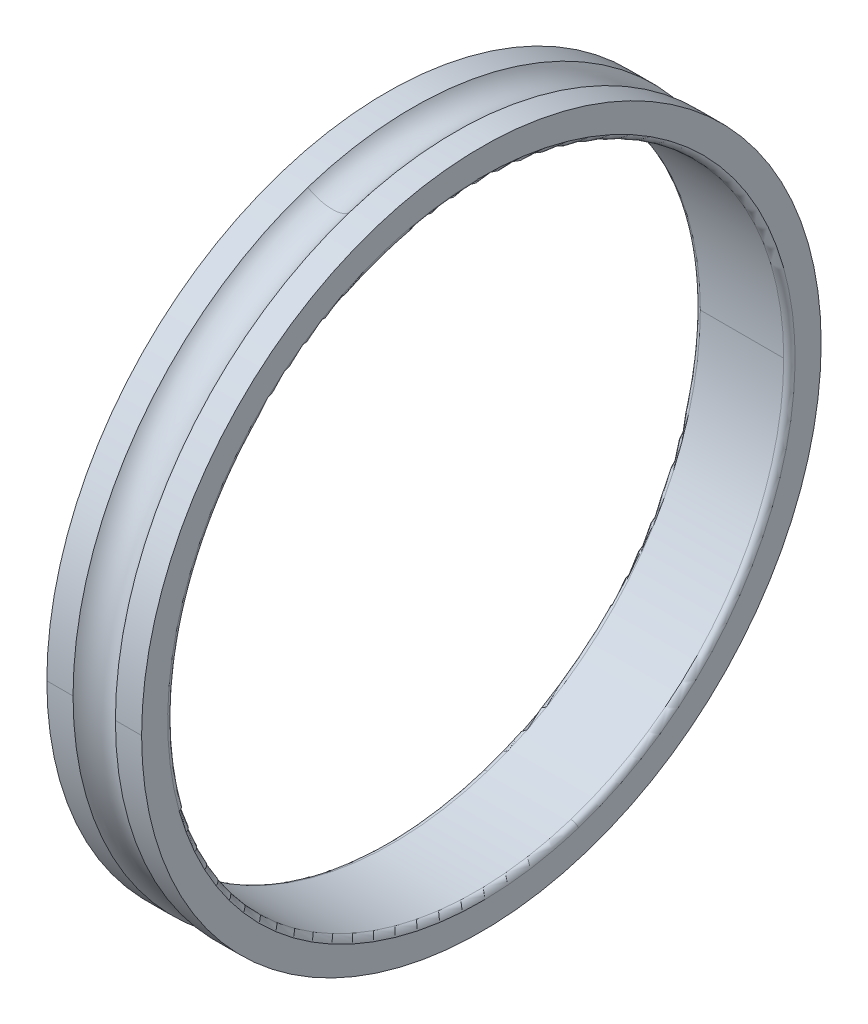
ISO-10303-21;
HEADER;
FILE_DESCRIPTION(('STEP AP214'),'2;1');
FILE_NAME('part.step','',(''),(''),'','','');
FILE_SCHEMA(('AUTOMOTIVE_DESIGN { 1 0 10303 214 1 1 1 1 }'));
ENDSEC;
DATA;
#1=APPLICATION_CONTEXT('core data for automotive mechanical design processes');
#2=APPLICATION_PROTOCOL_DEFINITION('international standard','automotive_design',2000,#1);
#3=PRODUCT_CONTEXT('',#1,'mechanical');
#4=PRODUCT('Part','Part','',(#3));
#5=PRODUCT_RELATED_PRODUCT_CATEGORY('part','',(#4));
#6=PRODUCT_DEFINITION_FORMATION('','',#4);
#7=PRODUCT_DEFINITION_CONTEXT('part definition',#1,'design');
#8=PRODUCT_DEFINITION('design','',#6,#7);
#9=PRODUCT_DEFINITION_SHAPE('','',#8);
#10=(LENGTH_UNIT() NAMED_UNIT(*) SI_UNIT(.MILLI.,.METRE.));
#11=(NAMED_UNIT(*) PLANE_ANGLE_UNIT() SI_UNIT($,.RADIAN.));
#12=(NAMED_UNIT(*) SI_UNIT($,.STERADIAN.) SOLID_ANGLE_UNIT());
#13=UNCERTAINTY_MEASURE_WITH_UNIT(LENGTH_MEASURE(1.E-05),#10,'distance_accuracy_value','');
#14=(GEOMETRIC_REPRESENTATION_CONTEXT(3) GLOBAL_UNCERTAINTY_ASSIGNED_CONTEXT((#13)) GLOBAL_UNIT_ASSIGNED_CONTEXT((#10,
#11,#12)) REPRESENTATION_CONTEXT('',''));
#15=CARTESIAN_POINT('',(0.,0.,0.));
#16=DIRECTION('',(0.,0.,1.));
#17=DIRECTION('',(1.,0.,0.));
#18=AXIS2_PLACEMENT_3D('',#15,#16,#17);
#19=CARTESIAN_POINT('',(10.,0.,0.));
#20=DIRECTION('',(1.,0.,0.));
#21=DIRECTION('',(0.,1.,0.));
#22=AXIS2_PLACEMENT_3D('',#19,#20,#21);
#23=CYLINDRICAL_SURFACE('',#22,35.85);
#24=DIRECTION('',(1.,0.,0.));
#25=VECTOR('',#24,1.);
#26=CARTESIAN_POINT('',(0.,0.,35.85));
#27=LINE('',#26,#25);
#28=CARTESIAN_POINT('',(0.,0.,35.85));
#29=VERTEX_POINT('',#28);
#30=CARTESIAN_POINT('',(2.7650986598957,0.,35.85));
#31=VERTEX_POINT('',#30);
#32=EDGE_CURVE('E11',#29,#31,#27,.T.);
#33=ORIENTED_EDGE('',*,*,#32,.F.);
#34=CARTESIAN_POINT('',(0.,0.,0.));
#35=DIRECTION('',(1.,0.,0.));
#36=DIRECTION('',(0.,0.,-1.));
#37=AXIS2_PLACEMENT_3D('',#34,#35,#36);
#38=CIRCLE('',#37,35.85);
#39=CARTESIAN_POINT('',(0.,0.,-35.85));
#40=VERTEX_POINT('',#39);
#41=EDGE_CURVE('E25',#29,#40,#38,.T.);
#42=ORIENTED_EDGE('',*,*,#41,.T.);
#43=DIRECTION('',(1.,0.,0.));
#44=VECTOR('',#43,1.);
#45=CARTESIAN_POINT('',(0.,0.,-35.85));
#46=LINE('',#45,#44);
#47=CARTESIAN_POINT('',(2.7650986598957,0.,-35.85));
#48=VERTEX_POINT('',#47);
#49=EDGE_CURVE('E326',#40,#48,#46,.T.);
#50=ORIENTED_EDGE('',*,*,#49,.T.);
#51=CARTESIAN_POINT('',(2.7650986598957,0.,0.));
#52=DIRECTION('',(1.,0.,0.));
#53=DIRECTION('',(0.,0.,-1.));
#54=AXIS2_PLACEMENT_3D('',#51,#52,#53);
#55=CIRCLE('',#54,35.85);
#56=CARTESIAN_POINT('',(2.7650986598957,-34.0953761091813,-11.0782592483419));
#57=VERTEX_POINT('',#56);
#58=EDGE_CURVE('E321',#57,#48,#55,.T.);
#59=ORIENTED_EDGE('',*,*,#58,.F.);
#60=CARTESIAN_POINT('',(2.7650986598957,0.,0.));
#61=DIRECTION('',(1.,0.,0.));
#62=DIRECTION('',(0.,0.,-1.));
#63=AXIS2_PLACEMENT_3D('',#60,#61,#62);
#64=CIRCLE('',#63,35.85);
#65=EDGE_CURVE('E316',#31,#57,#64,.T.);
#66=ORIENTED_EDGE('',*,*,#65,.F.);
#67=EDGE_LOOP('',(#33,#42,#50,#59,#66));
#68=FACE_BOUND('',#67,.T.);
#69=ADVANCED_FACE('F17',(#68),#23,.T.);
#70=CARTESIAN_POINT('',(5.,0.,0.));
#71=DIRECTION('',(1.,0.,0.));
#72=DIRECTION('',(0.,0.309016994374947,-0.951056516295154));
#73=AXIS2_PLACEMENT_3D('',#70,#71,#72);
#74=TOROIDAL_SURFACE('',#73,37.5,2.778);
#75=CARTESIAN_POINT('',(5.,-35.6646193610683,-11.5881372890605));
#76=DIRECTION('',(0.,0.309016994374947,-0.951056516295154));
#77=DIRECTION('',(-0.804500122427753,0.564882380088916,0.183541411345811));
#78=AXIS2_PLACEMENT_3D('',#75,#76,#77);
#79=CIRCLE('',#78,2.778);
#80=CARTESIAN_POINT('',(7.2349013401043,-34.0953761091813,-11.0782592483419));
#81=VERTEX_POINT('',#80);
#82=EDGE_CURVE('E312',#57,#81,#79,.T.);
#83=ORIENTED_EDGE('',*,*,#82,.T.);
#84=CARTESIAN_POINT('',(7.2349013401043,0.,0.));
#85=DIRECTION('',(1.,0.,0.));
#86=DIRECTION('',(0.,0.,-1.));
#87=AXIS2_PLACEMENT_3D('',#84,#85,#86);
#88=CIRCLE('',#87,35.85);
#89=CARTESIAN_POINT('',(7.2349013401043,0.,35.85));
#90=VERTEX_POINT('',#89);
#91=EDGE_CURVE('E110',#90,#81,#88,.T.);
#92=ORIENTED_EDGE('',*,*,#91,.F.);
#93=CARTESIAN_POINT('',(7.2349013401043,0.,0.));
#94=DIRECTION('',(1.,0.,0.));
#95=DIRECTION('',(0.,0.,-1.));
#96=AXIS2_PLACEMENT_3D('',#93,#94,#95);
#97=CIRCLE('',#96,35.85);
#98=CARTESIAN_POINT('',(7.2349013401043,34.0953761091813,11.0782592483419));
#99=VERTEX_POINT('',#98);
#100=EDGE_CURVE('E305',#99,#90,#97,.T.);
#101=ORIENTED_EDGE('',*,*,#100,.F.);
#102=CARTESIAN_POINT('',(5.,35.6646193610683,11.5881372890605));
#103=DIRECTION('',(0.,-0.309016994374947,0.951056516295154));
#104=DIRECTION('',(-0.804500122427754,-0.564882380088914,-0.183541411345811));
#105=AXIS2_PLACEMENT_3D('',#102,#103,#104);
#106=CIRCLE('',#105,2.778);
#107=CARTESIAN_POINT('',(2.7650986598957,34.0953761091813,11.0782592483419));
#108=VERTEX_POINT('',#107);
#109=EDGE_CURVE('E120',#108,#99,#106,.T.);
#110=ORIENTED_EDGE('',*,*,#109,.F.);
#111=CARTESIAN_POINT('',(2.7650986598957,0.,0.));
#112=DIRECTION('',(1.,0.,0.));
#113=DIRECTION('',(0.,0.,-1.));
#114=AXIS2_PLACEMENT_3D('',#111,#112,#113);
#115=CIRCLE('',#114,35.85);
#116=EDGE_CURVE('E297',#108,#31,#115,.T.);
#117=ORIENTED_EDGE('',*,*,#116,.T.);
#118=ORIENTED_EDGE('',*,*,#65,.T.);
#119=EDGE_LOOP('',(#83,#92,#101,#110,#117,#118));
#120=FACE_BOUND('',#119,.T.);
#121=ADVANCED_FACE('F339',(#120),#74,.F.);
#122=CARTESIAN_POINT('',(10.,0.,0.));
#123=DIRECTION('',(1.,0.,0.));
#124=DIRECTION('',(0.,-1.,0.));
#125=AXIS2_PLACEMENT_3D('',#122,#123,#124);
#126=CYLINDRICAL_SURFACE('',#125,35.85);
#127=ORIENTED_EDGE('',*,*,#32,.T.);
#128=ORIENTED_EDGE('',*,*,#116,.F.);
#129=CARTESIAN_POINT('',(2.7650986598957,0.,0.));
#130=DIRECTION('',(1.,0.,0.));
#131=DIRECTION('',(0.,0.,-1.));
#132=AXIS2_PLACEMENT_3D('',#129,#130,#131);
#133=CIRCLE('',#132,35.85);
#134=EDGE_CURVE('E293',#48,#108,#133,.T.);
#135=ORIENTED_EDGE('',*,*,#134,.F.);
#136=ORIENTED_EDGE('',*,*,#49,.F.);
#137=CARTESIAN_POINT('',(0.,0.,0.));
#138=DIRECTION('',(1.,0.,0.));
#139=DIRECTION('',(0.,0.,-1.));
#140=AXIS2_PLACEMENT_3D('',#137,#138,#139);
#141=CIRCLE('',#140,35.85);
#142=EDGE_CURVE('E289',#40,#29,#141,.T.);
#143=ORIENTED_EDGE('',*,*,#142,.T.);
#144=EDGE_LOOP('',(#127,#128,#135,#136,#143));
#145=FACE_BOUND('',#144,.T.);
#146=ADVANCED_FACE('F270',(#145),#126,.T.);
#147=CARTESIAN_POINT('',(0.,35.85,0.));
#148=DIRECTION('',(-1.,0.,0.));
#149=DIRECTION('',(0.,0.,1.));
#150=AXIS2_PLACEMENT_3D('',#147,#148,#149);
#151=PLANE('',#150);
#152=CARTESIAN_POINT('',(0.,0.,0.));
#153=DIRECTION('',(1.,0.,0.));
#154=DIRECTION('',(0.,0.,-1.));
#155=AXIS2_PLACEMENT_3D('',#152,#153,#154);
#156=CIRCLE('',#155,33.1);
#157=CARTESIAN_POINT('',(0.,31.4799706893696,10.2284625138108));
#158=VERTEX_POINT('',#157);
#159=CARTESIAN_POINT('',(0.,-31.4799706893696,-10.2284625138108));
#160=VERTEX_POINT('',#159);
#161=EDGE_CURVE('E287',#158,#160,#156,.T.);
#162=ORIENTED_EDGE('',*,*,#161,.T.);
#163=CARTESIAN_POINT('',(0.,-31.4799706893696,-10.2284625138108));
#164=CARTESIAN_POINT('',(0.,-29.8732222975507,-15.1732784787861));
#165=CARTESIAN_POINT('',(0.,-27.2959614558918,-19.8029100136131));
#166=CARTESIAN_POINT('',(0.,-23.8290176388715,-23.8619609163292));
#167=CARTESIAN_POINT('',(0.,-15.4904675059238,-30.4017426634076));
#168=CARTESIAN_POINT('',(0.,-5.29838951479689,-33.3038175593955));
#169=CARTESIAN_POINT('',(0.,0.0232956870978851,-33.722652342829));
#170=CARTESIAN_POINT('',(0.,10.5438616298009,-32.4506693562922));
#171=CARTESIAN_POINT('',(0.,19.8028311085433,-27.2958917020649));
#172=CARTESIAN_POINT('',(0.,23.8619799667405,-23.8290391654151));
#173=CARTESIAN_POINT('',(0.,30.4017474446471,-15.4904581222128));
#174=CARTESIAN_POINT('',(0.,33.3037889465051,-5.29838675567528));
#175=CARTESIAN_POINT('',(0.,33.7227551540967,0.0232728518260998));
#176=CARTESIAN_POINT('',(0.,33.0865738342163,5.28359935523333));
#177=CARTESIAN_POINT('',(0.,31.4799706893696,10.2284625138107));
#178=B_SPLINE_CURVE_WITH_KNOTS('',5,(#163,#164,#165,#166,#167,#168,#169,#170,#171,#172,#173,
#174,#175,#176,#177),.UNSPECIFIED.,.F.,.F.,(6,3,3,3,6),(0.,0.785398163397448,1.5707963267949,
2.35619449019234,3.14159265358979),.UNSPECIFIED.);
#179=EDGE_CURVE('E285',#160,#158,#178,.T.);
#180=ORIENTED_EDGE('',*,*,#179,.T.);
#181=EDGE_LOOP('',(#162,#180));
#182=FACE_BOUND('',#181,.T.);
#183=ORIENTED_EDGE('',*,*,#41,.F.);
#184=ORIENTED_EDGE('',*,*,#142,.F.);
#185=EDGE_LOOP('',(#183,#184));
#186=FACE_BOUND('',#185,.T.);
#187=ADVANCED_FACE('F264',(#182,#186),#151,.T.);
#188=CARTESIAN_POINT('',(0.599999999999877,0.,0.));
#189=DIRECTION('',(1.,0.,0.));
#190=DIRECTION('',(0.,-0.309016994374947,0.951056516295154));
#191=AXIS2_PLACEMENT_3D('',#188,#189,#190);
#192=TOROIDAL_SURFACE('',#191,33.1,0.599999999999877);
#193=CARTESIAN_POINT('',(0.599999999999877,-31.4799706893696,-10.2284625138108));
#194=DIRECTION('',(0.,0.309016994374947,-0.951056516295154));
#195=DIRECTION('',(-1.,0.,0.));
#196=AXIS2_PLACEMENT_3D('',#193,#194,#195);
#197=CIRCLE('',#196,0.599999999999877);
#198=CARTESIAN_POINT('',(0.600000000000001,-30.9093367795926,-10.0430523171858));
#199=VERTEX_POINT('',#198);
#200=EDGE_CURVE('E494',#160,#199,#197,.T.);
#201=ORIENTED_EDGE('',*,*,#200,.T.);
#202=CARTESIAN_POINT('',(0.6,0.,0.));
#203=DIRECTION('',(1.,0.,0.));
#204=DIRECTION('',(0.,0.,-1.));
#205=AXIS2_PLACEMENT_3D('',#202,#203,#204);
#206=CIRCLE('',#205,32.5);
#207=CARTESIAN_POINT('',(0.6,0.,-32.5));
#208=VERTEX_POINT('',#207);
#209=EDGE_CURVE('E492',#199,#208,#206,.T.);
#210=ORIENTED_EDGE('',*,*,#209,.T.);
#211=CARTESIAN_POINT('',(0.6,0.,0.));
#212=DIRECTION('',(1.,0.,0.));
#213=DIRECTION('',(0.,0.,-1.));
#214=AXIS2_PLACEMENT_3D('',#211,#212,#213);
#215=CIRCLE('',#214,32.5);
#216=CARTESIAN_POINT('',(0.600000000000001,30.9093367795926,10.0430523171858));
#217=VERTEX_POINT('',#216);
#218=EDGE_CURVE('E490',#208,#217,#215,.T.);
#219=ORIENTED_EDGE('',*,*,#218,.T.);
#220=CARTESIAN_POINT('',(0.599999999999877,31.4799706893696,10.2284625138108));
#221=DIRECTION('',(0.,-0.309016994374947,0.951056516295154));
#222=DIRECTION('',(-1.,0.,0.));
#223=AXIS2_PLACEMENT_3D('',#220,#221,#222);
#224=CIRCLE('',#223,0.599999999999877);
#225=EDGE_CURVE('E244',#158,#217,#224,.T.);
#226=ORIENTED_EDGE('',*,*,#225,.F.);
#227=ORIENTED_EDGE('',*,*,#179,.F.);
#228=EDGE_LOOP('',(#201,#210,#219,#226,#227));
#229=FACE_BOUND('',#228,.T.);
#230=ADVANCED_FACE('F253',(#229),#192,.T.);
#231=CARTESIAN_POINT('',(0.599999999999877,0.,0.));
#232=DIRECTION('',(1.,0.,0.));
#233=DIRECTION('',(0.,0.309016994374947,-0.951056516295154));
#234=AXIS2_PLACEMENT_3D('',#231,#232,#233);
#235=TOROIDAL_SURFACE('',#234,33.1,0.599999999999877);
#236=ORIENTED_EDGE('',*,*,#200,.F.);
#237=ORIENTED_EDGE('',*,*,#161,.F.);
#238=ORIENTED_EDGE('',*,*,#225,.T.);
#239=CARTESIAN_POINT('',(0.6,0.,0.));
#240=DIRECTION('',(1.,0.,0.));
#241=DIRECTION('',(0.,0.,-1.));
#242=AXIS2_PLACEMENT_3D('',#239,#240,#241);
#243=CIRCLE('',#242,32.5);
#244=CARTESIAN_POINT('',(0.6,0.,32.5));
#245=VERTEX_POINT('',#244);
#246=EDGE_CURVE('E240',#217,#245,#243,.T.);
#247=ORIENTED_EDGE('',*,*,#246,.T.);
#248=CARTESIAN_POINT('',(0.6,0.,0.));
#249=DIRECTION('',(1.,0.,0.));
#250=DIRECTION('',(0.,0.,-1.));
#251=AXIS2_PLACEMENT_3D('',#248,#249,#250);
#252=CIRCLE('',#251,32.5);
#253=EDGE_CURVE('E235',#245,#199,#252,.T.);
#254=ORIENTED_EDGE('',*,*,#253,.T.);
#255=EDGE_LOOP('',(#236,#237,#238,#247,#254));
#256=FACE_BOUND('',#255,.T.);
#257=ADVANCED_FACE('F263',(#256),#235,.T.);
#258=CARTESIAN_POINT('',(10.,0.,0.));
#259=DIRECTION('',(1.,0.,0.));
#260=DIRECTION('',(0.,1.,0.));
#261=AXIS2_PLACEMENT_3D('',#258,#259,#260);
#262=CYLINDRICAL_SURFACE('',#261,32.5);
#263=DIRECTION('',(1.,0.,0.));
#264=VECTOR('',#263,1.);
#265=CARTESIAN_POINT('',(0.6,0.,32.5));
#266=LINE('',#265,#264);
#267=CARTESIAN_POINT('',(9.4,0.,32.5));
#268=VERTEX_POINT('',#267);
#269=EDGE_CURVE('E231',#245,#268,#266,.T.);
#270=ORIENTED_EDGE('',*,*,#269,.T.);
#271=CARTESIAN_POINT('',(9.4,0.,0.));
#272=DIRECTION('',(1.,0.,0.));
#273=DIRECTION('',(0.,0.,-1.));
#274=AXIS2_PLACEMENT_3D('',#271,#272,#273);
#275=CIRCLE('',#274,32.5);
#276=CARTESIAN_POINT('',(9.4,-30.9093367795926,-10.0430523171858));
#277=VERTEX_POINT('',#276);
#278=EDGE_CURVE('E227',#268,#277,#275,.T.);
#279=ORIENTED_EDGE('',*,*,#278,.T.);
#280=CARTESIAN_POINT('',(9.4,0.,0.));
#281=DIRECTION('',(1.,0.,0.));
#282=DIRECTION('',(0.,0.,-1.));
#283=AXIS2_PLACEMENT_3D('',#280,#281,#282);
#284=CIRCLE('',#283,32.5);
#285=CARTESIAN_POINT('',(9.4,0.,-32.5));
#286=VERTEX_POINT('',#285);
#287=EDGE_CURVE('E223',#277,#286,#284,.T.);
#288=ORIENTED_EDGE('',*,*,#287,.T.);
#289=DIRECTION('',(1.,0.,0.));
#290=VECTOR('',#289,1.);
#291=CARTESIAN_POINT('',(0.6,0.,-32.5));
#292=LINE('',#291,#290);
#293=EDGE_CURVE('E218',#208,#286,#292,.T.);
#294=ORIENTED_EDGE('',*,*,#293,.F.);
#295=ORIENTED_EDGE('',*,*,#209,.F.);
#296=ORIENTED_EDGE('',*,*,#253,.F.);
#297=EDGE_LOOP('',(#270,#279,#288,#294,#295,#296));
#298=FACE_BOUND('',#297,.T.);
#299=ADVANCED_FACE('F390',(#298),#262,.F.);
#300=CARTESIAN_POINT('',(10.,0.,0.));
#301=DIRECTION('',(1.,0.,0.));
#302=DIRECTION('',(0.,-1.,0.));
#303=AXIS2_PLACEMENT_3D('',#300,#301,#302);
#304=CYLINDRICAL_SURFACE('',#303,32.5);
#305=ORIENTED_EDGE('',*,*,#269,.F.);
#306=ORIENTED_EDGE('',*,*,#246,.F.);
#307=ORIENTED_EDGE('',*,*,#218,.F.);
#308=ORIENTED_EDGE('',*,*,#293,.T.);
#309=CARTESIAN_POINT('',(9.4,0.,0.));
#310=DIRECTION('',(1.,0.,0.));
#311=DIRECTION('',(0.,0.,-1.));
#312=AXIS2_PLACEMENT_3D('',#309,#310,#311);
#313=CIRCLE('',#312,32.5);
#314=CARTESIAN_POINT('',(9.4,30.9093367795926,10.0430523171858));
#315=VERTEX_POINT('',#314);
#316=EDGE_CURVE('E214',#286,#315,#313,.T.);
#317=ORIENTED_EDGE('',*,*,#316,.T.);
#318=CARTESIAN_POINT('',(9.4,0.,0.));
#319=DIRECTION('',(1.,0.,0.));
#320=DIRECTION('',(0.,0.,-1.));
#321=AXIS2_PLACEMENT_3D('',#318,#319,#320);
#322=CIRCLE('',#321,32.5);
#323=EDGE_CURVE('E209',#315,#268,#322,.T.);
#324=ORIENTED_EDGE('',*,*,#323,.T.);
#325=EDGE_LOOP('',(#305,#306,#307,#308,#317,#324));
#326=FACE_BOUND('',#325,.T.);
#327=ADVANCED_FACE('F400',(#326),#304,.F.);
#328=CARTESIAN_POINT('',(9.4,0.,0.));
#329=DIRECTION('',(1.,0.,0.));
#330=DIRECTION('',(0.,0.309016994374947,-0.951056516295154));
#331=AXIS2_PLACEMENT_3D('',#328,#329,#330);
#332=TOROIDAL_SURFACE('',#331,33.1,0.599999999999927);
#333=CARTESIAN_POINT('',(9.4,-31.4799706893696,-10.2284625138108));
#334=DIRECTION('',(0.,0.309016994374947,-0.951056516295154));
#335=DIRECTION('',(0.,0.951056516295154,0.309016994374947));
#336=AXIS2_PLACEMENT_3D('',#333,#334,#335);
#337=CIRCLE('',#336,0.59999999999993);
#338=CARTESIAN_POINT('',(9.99999999999993,-31.4799706893696,-10.2284625138108));
#339=VERTEX_POINT('',#338);
#340=EDGE_CURVE('E188',#277,#339,#337,.T.);
#341=ORIENTED_EDGE('',*,*,#340,.F.);
#342=ORIENTED_EDGE('',*,*,#278,.F.);
#343=ORIENTED_EDGE('',*,*,#323,.F.);
#344=CARTESIAN_POINT('',(9.4,31.4799706893696,10.2284625138108));
#345=DIRECTION('',(0.,-0.309016994374947,0.951056516295154));
#346=DIRECTION('',(0.,-0.951056516295154,-0.309016994374947));
#347=AXIS2_PLACEMENT_3D('',#344,#345,#346);
#348=CIRCLE('',#347,0.59999999999993);
#349=CARTESIAN_POINT('',(9.99999999999993,31.4799706893696,10.2284625138108));
#350=VERTEX_POINT('',#349);
#351=EDGE_CURVE('E187',#315,#350,#348,.T.);
#352=ORIENTED_EDGE('',*,*,#351,.T.);
#353=CARTESIAN_POINT('',(9.99999999999993,31.4799706893696,10.2284625138108));
#354=CARTESIAN_POINT('',(9.99999999999993,31.3126186201895,10.7435564000536));
#355=CARTESIAN_POINT('',(9.99999999999993,31.1326031832768,11.254534680821));
#356=CARTESIAN_POINT('',(9.99999999999993,30.7477264537561,12.2670469839427));
#357=CARTESIAN_POINT('',(9.99999999999993,30.5428651611481,12.7685810062971));
#358=CARTESIAN_POINT('',(9.99999999999993,30.1087776000063,13.7609917451309));
#359=CARTESIAN_POINT('',(9.99999999999993,29.8795513314726,14.2518684616103));
#360=CARTESIAN_POINT('',(9.99999999999993,29.3972894339351,15.2217833120077));
#361=CARTESIAN_POINT('',(9.99999999999993,29.1442538049313,15.7008214459257));
#362=CARTESIAN_POINT('',(9.99999999999993,28.6149818632878,16.6459047411728));
#363=CARTESIAN_POINT('',(9.99999999999993,28.3387455506482,17.1119499025018));
#364=CARTESIAN_POINT('',(9.99999999999993,27.7637379625461,18.0299246014538));
#365=CARTESIAN_POINT('',(9.99999999999993,27.4649666870837,18.4818541390767));
#366=CARTESIAN_POINT('',(9.99999999999993,26.8456088743052,19.3705088279913));
#367=CARTESIAN_POINT('',(9.99999999999993,26.5250223369891,19.8072339792831));
#368=CARTESIAN_POINT('',(9.99999999999993,25.8628063390226,20.6644277930343));
#369=CARTESIAN_POINT('',(9.99999999999993,25.5211768783722,21.0848964554938));
#370=CARTESIAN_POINT('',(9.99999999999993,24.8176980443498,21.9085643439645));
#371=CARTESIAN_POINT('',(9.99999999999993,24.4558486709777,22.3117635699757));
#372=CARTESIAN_POINT('',(9.99999999999993,23.712801739601,23.0999212437751));
#373=CARTESIAN_POINT('',(9.99999999999993,23.3316041815964,23.4848796915634));
#374=CARTESIAN_POINT('',(9.99999999999993,22.5507792189246,24.2356284101699));
#375=CARTESIAN_POINT('',(9.99999999999993,22.1511518142575,24.6014186809883));
#376=CARTESIAN_POINT('',(9.99999999999993,21.3344298957718,25.3129498248875));
#377=CARTESIAN_POINT('',(9.99999999999993,20.9173353819533,25.6586906979684));
#378=CARTESIAN_POINT('',(9.99999999999993,20.0666840623577,26.329290126337));
#379=CARTESIAN_POINT('',(9.99999999999993,19.6331272565806,26.6541486816246));
#380=CARTESIAN_POINT('',(9.99999999999993,18.7505958293945,27.2822008616952));
#381=CARTESIAN_POINT('',(9.99999999999993,18.3016212079856,27.5853944864782));
#382=CARTESIAN_POINT('',(9.99999999999993,17.3893357687226,28.16938638554));
#383=CARTESIAN_POINT('',(9.99999999999993,16.9260249508685,28.4501846598189));
#384=CARTESIAN_POINT('',(9.99999999999993,15.9861832750572,28.988709390235));
#385=CARTESIAN_POINT('',(9.99999999999993,15.5096524170999,29.2464358463722));
#386=CARTESIAN_POINT('',(9.99999999999993,14.544518665658,29.7381960548978));
#387=CARTESIAN_POINT('',(9.99999999999993,14.0559157721734,29.9722298072863));
#388=CARTESIAN_POINT('',(9.99999999999993,13.0678150368439,30.4160408005061));
#389=CARTESIAN_POINT('',(9.99999999999993,12.568317194999,30.6258180413374));
#390=CARTESIAN_POINT('',(9.99999999999993,11.5596298970006,31.0206106396954));
#391=CARTESIAN_POINT('',(9.99999999999993,11.0504404408472,31.2056259972221));
#392=CARTESIAN_POINT('',(9.99999999999993,10.0235965962315,31.5504491107691));
#393=CARTESIAN_POINT('',(9.99999999999993,9.50594220776919,31.7102568667895));
#394=CARTESIAN_POINT('',(9.99999999999993,8.46341557329866,32.004279786442));
#395=CARTESIAN_POINT('',(9.99999999999993,7.93854332729044,32.1384949500742));
#396=CARTESIAN_POINT('',(9.99999999999993,6.88284544094209,32.3810093488655));
#397=CARTESIAN_POINT('',(9.99999999999993,6.35201980060196,32.4893085840246));
#398=CARTESIAN_POINT('',(9.99999999999993,5.28569393105222,32.6797302235262));
#399=CARTESIAN_POINT('',(9.99999999999993,4.75019370184261,32.7618526278687));
#400=CARTESIAN_POINT('',(9.99999999999993,3.67580872151035,32.8997227656721));
#401=CARTESIAN_POINT('',(9.99999999999993,3.13692397038771,32.955470499133));
#402=CARTESIAN_POINT('',(9.99999999999993,2.05706816679555,33.0404569940001));
#403=CARTESIAN_POINT('',(9.99999999999993,1.51609711432605,33.0696957554064));
#404=CARTESIAN_POINT('',(9.99999999999993,0.433371954689048,33.1015938674274));
#405=CARTESIAN_POINT('',(9.99999999999993,-0.108382152478446,33.1042532180419));
#406=CARTESIAN_POINT('',(9.99999999999993,-1.1913682884152,33.0829861018708));
#407=CARTESIAN_POINT('',(9.99999999999993,-1.73260031718446,33.059059635085));
#408=CARTESIAN_POINT('',(9.99999999999993,-2.81323842096112,32.9846785250674));
#409=CARTESIAN_POINT('',(9.99999999999993,-3.35264449596852,32.9342238818356));
#410=CARTESIAN_POINT('',(9.99999999999993,-4.42833121574036,32.8069079685806));
#411=CARTESIAN_POINT('',(9.99999999999993,-4.96461186050481,32.7300466985574));
#412=CARTESIAN_POINT('',(9.99999999999993,-6.03275577274489,32.5501026972516));
#413=CARTESIAN_POINT('',(9.99999999999993,-6.56461904022052,32.447019965969));
#414=CARTESIAN_POINT('',(9.99999999999993,-7.62264689268588,32.2148813774728));
#415=CARTESIAN_POINT('',(9.99999999999993,-8.14881147767562,32.0858255202592));
#416=CARTESIAN_POINT('',(9.99999999999993,-9.19417438859737,31.8020515867652));
#417=CARTESIAN_POINT('',(9.99999999999993,-9.71337271452939,31.6473335104848));
#418=CARTESIAN_POINT('',(9.99999999999993,-10.7435523130922,31.3126078682544));
#419=CARTESIAN_POINT('',(9.99999999999993,-11.2545335857229,31.1326003023045));
#420=CARTESIAN_POINT('',(9.99999999999993,-12.2670480790407,30.7477293347284));
#421=CARTESIAN_POINT('',(9.99999999999993,-12.7685812997277,30.5428659331023));
#422=CARTESIAN_POINT('',(9.99999999999993,-13.7609914517003,30.1087768280521));
#423=CARTESIAN_POINT('',(9.99999999999993,-14.2518683829858,29.8795511246281));
#424=CARTESIAN_POINT('',(9.99999999999993,-15.2217833906322,29.3972896407796));
#425=CARTESIAN_POINT('',(9.99999999999993,-15.7008214669931,29.1442538603551));
#426=CARTESIAN_POINT('',(9.99999999999993,-16.6459047201054,28.614981807864));
#427=CARTESIAN_POINT('',(9.99999999999993,-17.1119498968568,28.3387455357974));
#428=CARTESIAN_POINT('',(9.99999999999993,-18.0299246070987,27.7637379773969));
#429=CARTESIAN_POINT('',(9.99999999999993,-18.4818541405892,27.464966691063));
#430=CARTESIAN_POINT('',(9.99999999999993,-19.3705088264787,26.845608870326));
#431=CARTESIAN_POINT('',(9.99999999999993,-19.8072339788777,26.5250223359229));
#432=CARTESIAN_POINT('',(9.99999999999993,-20.6644277934395,25.8628063400888));
#433=CARTESIAN_POINT('',(9.99999999999993,-21.0848964556023,25.5211768786579));
#434=CARTESIAN_POINT('',(9.99999999999993,-21.9085643438558,24.8176980440641));
#435=CARTESIAN_POINT('',(9.99999999999993,-22.3117635699466,24.4558486709012));
#436=CARTESIAN_POINT('',(9.99999999999993,-23.0999212438042,23.7128017396776));
#437=CARTESIAN_POINT('',(9.99999999999993,-23.4848796915711,23.331604181617));
#438=CARTESIAN_POINT('',(9.99999999999993,-24.2356284101621,22.5507792189041));
#439=CARTESIAN_POINT('',(9.99999999999993,-24.6014186809862,22.151151814252));
#440=CARTESIAN_POINT('',(9.99999999999993,-25.3129498248896,21.3344298957773));
#441=CARTESIAN_POINT('',(9.99999999999993,-25.6586906979689,20.9173353819548));
#442=CARTESIAN_POINT('',(9.99999999999993,-26.3292901263364,20.0666840623562));
#443=CARTESIAN_POINT('',(9.99999999999993,-26.6541486816244,19.6331272565802));
#444=CARTESIAN_POINT('',(9.99999999999993,-27.2822008616953,18.750595829395));
#445=CARTESIAN_POINT('',(9.99999999999993,-27.5853944864782,18.3016212079857));
#446=CARTESIAN_POINT('',(9.99999999999993,-28.16938638554,17.3893357687225));
#447=CARTESIAN_POINT('',(9.99999999999993,-28.4501846598189,16.9260249508685));
#448=CARTESIAN_POINT('',(9.99999999999993,-28.988709390235,15.9861832750572));
#449=CARTESIAN_POINT('',(9.99999999999993,-29.2464358463722,15.5096524170999));
#450=CARTESIAN_POINT('',(9.99999999999993,-29.7381960548978,14.5445186656581));
#451=CARTESIAN_POINT('',(9.99999999999993,-29.9722298072863,14.0559157721735));
#452=CARTESIAN_POINT('',(9.99999999999993,-30.4160408005061,13.067815036844));
#453=CARTESIAN_POINT('',(9.99999999999993,-30.6258180413375,12.568317194999));
#454=CARTESIAN_POINT('',(9.99999999999993,-31.0206106396953,11.5596298970007));
#455=CARTESIAN_POINT('',(9.99999999999993,-31.2056259972217,11.0504404408474));
#456=CARTESIAN_POINT('',(9.99999999999993,-31.5504491107695,10.0235965962314));
#457=CARTESIAN_POINT('',(9.99999999999993,-31.710256866791,9.50594220776882));
#458=CARTESIAN_POINT('',(9.99999999999993,-32.0042797864405,8.46341557329911));
#459=CARTESIAN_POINT('',(9.99999999999993,-32.1384949500686,7.93854332729201));
#460=CARTESIAN_POINT('',(9.99999999999993,-32.3810093488712,6.88284544094059));
#461=CARTESIAN_POINT('',(9.99999999999993,-32.4893085840458,6.35201980059626));
#462=CARTESIAN_POINT('',(9.99999999999993,-32.679730223505,5.28569393105803));
#463=CARTESIAN_POINT('',(9.99999999999993,-32.7618526277897,4.75019370186413));
#464=CARTESIAN_POINT('',(9.99999999999993,-32.8997227657511,3.67580872148896));
#465=CARTESIAN_POINT('',(9.99999999999993,-32.9554704994279,3.13692397030769));
#466=CARTESIAN_POINT('',(9.99999999999993,-33.0404569937052,2.05706816687568));
#467=CARTESIAN_POINT('',(9.99999999999993,-33.0696957543056,1.51609711462494));
#468=CARTESIAN_POINT('',(9.99999999999993,-33.1015938685282,0.433371954390277));
#469=CARTESIAN_POINT('',(9.99999999999993,-33.1042532221503,-0.108382153593637));
#470=CARTESIAN_POINT('',(9.99999999999993,-33.0829860977624,-1.19136828729989));
#471=CARTESIAN_POINT('',(9.99999999999993,-33.0590596197525,-1.73260031302223));
#472=CARTESIAN_POINT('',(9.99999999999993,-32.9846785404,-2.81323842512324));
#473=CARTESIAN_POINT('',(9.99999999999993,-32.9342239390575,-3.35264451150192));
#474=CARTESIAN_POINT('',(9.99999999999993,-32.8069079113587,-4.42833120020689));
#475=CARTESIAN_POINT('',(9.99999999999993,-32.7300464850024,-4.96461180253319));
#476=CARTESIAN_POINT('',(9.99999999999993,-32.5501029108067,-6.03275583071645));
#477=CARTESIAN_POINT('',(9.99999999999993,-32.4470207629673,-6.56461925657341));
#478=CARTESIAN_POINT('',(9.99999999999993,-32.2148805804745,-7.6226466763329));
#479=CARTESIAN_POINT('',(9.99999999999993,-32.0858225458212,-8.14881067023542));
#480=CARTESIAN_POINT('',(9.99999999999993,-31.8020545612032,-9.19417519603746));
#481=CARTESIAN_POINT('',(9.99999999999993,-31.6473446112386,-9.71337572793698));
#482=CARTESIAN_POINT('',(9.99999999999993,-31.4799706893696,-10.2284625138107));
#483=B_SPLINE_CURVE_WITH_KNOTS('',3,(#353,#354,#355,#356,#357,#358,#359,#360,#361,#362,#363,
#364,#365,#366,#367,#368,#369,#370,#371,#372,#373,#374,#375,#376,#377,#378,#379,#380,#381,#382,
#383,#384,#385,#386,#387,#388,#389,#390,#391,#392,#393,#394,#395,#396,#397,#398,#399,#400,#401,
#402,#403,#404,#405,#406,#407,#408,#409,#410,#411,#412,#413,#414,#415,#416,#417,#418,#419,#420,
#421,#422,#423,#424,#425,#426,#427,#428,#429,#430,#431,#432,#433,#434,#435,#436,#437,#438,#439,
#440,#441,#442,#443,#444,#445,#446,#447,#448,#449,#450,#451,#452,#453,#454,#455,#456,#457,#458,
#459,#460,#461,#462,#463,#464,#465,#466,#467,#468,#469,#470,#471,#472,#473,#474,#475,#476,#477,
#478,#479,#480,#481,#482),.UNSPECIFIED.,.F.,.F.,(4,2,2,2,2,2,2,2,2,2,2,2,2,2,2,2,2,2,2,2,2,2,2,
2,2,2,2,2,2,2,2,2,2,2,2,2,2,2,2,2,2,2,2,2,2,2,2,2,2,2,2,2,2,2,2,2,2,2,2,2,2,2,2,2,4),(0.,
1.62462932821679,3.24925865643358,4.87388798465037,6.49851731286716,8.12314664108395,
9.74777596930076,11.3724052975175,12.9970346257343,14.6216639539511,16.2462932821679,
17.8709226103847,19.4955519386015,21.1201812668183,22.7448105950351,24.3694399232519,
25.9940692514687,27.6186985796855,29.2433279079023,30.8679572361191,32.4925865643358,
34.1172158925526,35.7418452207694,37.3664745489862,38.991103877203,40.6157332054198,
42.2403625336366,43.8649918618534,45.4896211900702,47.114250518287,48.7388798465038,
50.3635091747206,51.9881385029374,53.6127678311542,55.2373971593709,56.8620264875877,
58.4866558158045,60.1112851440213,61.7359144722381,63.3605438004549,64.9851731286717,
66.6098024568885,68.2344317851053,69.8590611133221,71.4836904415389,73.1083197697557,
74.7329490979725,76.3575784261893,77.9822077544061,79.6068370826228,81.2314664108396,
82.8560957390564,84.4807250672733,86.10535439549,87.7299837237068,89.3546130519236,
90.9792423801404,92.6038717083572,94.228501036574,95.8531303647908,97.4777596930076,
99.1023890212244,100.727018349441,102.351647677658,103.976277005875),.UNSPECIFIED.);
#484=EDGE_CURVE('E182',#350,#339,#483,.T.);
#485=ORIENTED_EDGE('',*,*,#484,.T.);
#486=EDGE_LOOP('',(#341,#342,#343,#352,#485));
#487=FACE_BOUND('',#486,.T.);
#488=ADVANCED_FACE('F162',(#487),#332,.T.);
#489=CARTESIAN_POINT('',(10.,33.1,0.));
#490=DIRECTION('',(1.,0.,0.));
#491=DIRECTION('',(0.,0.,-1.));
#492=AXIS2_PLACEMENT_3D('',#489,#490,#491);
#493=PLANE('',#492);
#494=CARTESIAN_POINT('',(10.,0.,0.));
#495=DIRECTION('',(1.,0.,0.));
#496=DIRECTION('',(0.,0.,-1.));
#497=AXIS2_PLACEMENT_3D('',#494,#495,#496);
#498=CIRCLE('',#497,35.85);
#499=CARTESIAN_POINT('',(10.,0.,-35.85));
#500=VERTEX_POINT('',#499);
#501=CARTESIAN_POINT('',(10.,0.,35.85));
#502=VERTEX_POINT('',#501);
#503=EDGE_CURVE('E127',#500,#502,#498,.T.);
#504=ORIENTED_EDGE('',*,*,#503,.T.);
#505=CARTESIAN_POINT('',(10.,0.,0.));
#506=DIRECTION('',(1.,0.,0.));
#507=DIRECTION('',(0.,0.,-1.));
#508=AXIS2_PLACEMENT_3D('',#505,#506,#507);
#509=CIRCLE('',#508,35.85);
#510=EDGE_CURVE('E190',#502,#500,#509,.T.);
#511=ORIENTED_EDGE('',*,*,#510,.T.);
#512=EDGE_LOOP('',(#504,#511));
#513=FACE_BOUND('',#512,.T.);
#514=CARTESIAN_POINT('',(9.99999999999993,-31.4799706893696,-10.2284625138108));
#515=CARTESIAN_POINT('',(9.99999999999993,-31.3126186201895,-10.7435564000536));
#516=CARTESIAN_POINT('',(9.99999999999993,-31.1326031832768,-11.2545346808209));
#517=CARTESIAN_POINT('',(9.99999999999993,-30.7477264537561,-12.2670469839427));
#518=CARTESIAN_POINT('',(9.99999999999993,-30.5428651611481,-12.7685810062971));
#519=CARTESIAN_POINT('',(9.99999999999993,-30.1087776000063,-13.7609917451309));
#520=CARTESIAN_POINT('',(9.99999999999993,-29.8795513314726,-14.2518684616103));
#521=CARTESIAN_POINT('',(9.99999999999993,-29.3972894339351,-15.2217833120077));
#522=CARTESIAN_POINT('',(9.99999999999993,-29.1442538049313,-15.7008214459257));
#523=CARTESIAN_POINT('',(9.99999999999993,-28.6149818632878,-16.6459047411728));
#524=CARTESIAN_POINT('',(9.99999999999993,-28.3387455506482,-17.1119499025018));
#525=CARTESIAN_POINT('',(9.99999999999993,-27.7637379625461,-18.0299246014538));
#526=CARTESIAN_POINT('',(9.99999999999993,-27.4649666870837,-18.4818541390767));
#527=CARTESIAN_POINT('',(9.99999999999993,-26.8456088743052,-19.3705088279913));
#528=CARTESIAN_POINT('',(9.99999999999993,-26.5250223369891,-19.807233979283));
#529=CARTESIAN_POINT('',(9.99999999999993,-25.8628063390226,-20.6644277930343));
#530=CARTESIAN_POINT('',(9.99999999999993,-25.5211768783722,-21.0848964554937));
#531=CARTESIAN_POINT('',(9.99999999999993,-24.8176980443498,-21.9085643439645));
#532=CARTESIAN_POINT('',(9.99999999999993,-24.4558486709778,-22.3117635699757));
#533=CARTESIAN_POINT('',(9.99999999999993,-23.7128017396011,-23.0999212437751));
#534=CARTESIAN_POINT('',(9.99999999999993,-23.3316041815964,-23.4848796915633));
#535=CARTESIAN_POINT('',(9.99999999999993,-22.5507792189246,-24.2356284101699));
#536=CARTESIAN_POINT('',(9.99999999999993,-22.1511518142575,-24.6014186809883));
#537=CARTESIAN_POINT('',(9.99999999999993,-21.3344298957718,-25.3129498248875));
#538=CARTESIAN_POINT('',(9.99999999999993,-20.9173353819533,-25.6586906979684));
#539=CARTESIAN_POINT('',(9.99999999999993,-20.0666840623577,-26.3292901263369));
#540=CARTESIAN_POINT('',(9.99999999999993,-19.6331272565806,-26.6541486816246));
#541=CARTESIAN_POINT('',(9.99999999999993,-18.7505958293946,-27.2822008616952));
#542=CARTESIAN_POINT('',(9.99999999999993,-18.3016212079856,-27.5853944864782));
#543=CARTESIAN_POINT('',(9.99999999999993,-17.3893357687226,-28.16938638554));
#544=CARTESIAN_POINT('',(9.99999999999993,-16.9260249508685,-28.4501846598189));
#545=CARTESIAN_POINT('',(9.99999999999993,-15.9861832750572,-28.9887093902349));
#546=CARTESIAN_POINT('',(9.99999999999993,-15.5096524170999,-29.2464358463721));
#547=CARTESIAN_POINT('',(9.99999999999993,-14.5445186656581,-29.7381960548978));
#548=CARTESIAN_POINT('',(9.99999999999993,-14.0559157721735,-29.9722298072863));
#549=CARTESIAN_POINT('',(9.99999999999993,-13.0678150368439,-30.4160408005061));
#550=CARTESIAN_POINT('',(9.99999999999993,-12.568317194999,-30.6258180413374));
#551=CARTESIAN_POINT('',(9.99999999999993,-11.5596298970007,-31.0206106396954));
#552=CARTESIAN_POINT('',(9.99999999999993,-11.0504404408473,-31.2056259972221));
#553=CARTESIAN_POINT('',(9.99999999999993,-10.0235965962315,-31.5504491107691));
#554=CARTESIAN_POINT('',(9.99999999999993,-9.50594220776922,-31.7102568667894));
#555=CARTESIAN_POINT('',(9.99999999999993,-8.4634155732987,-32.004279786442));
#556=CARTESIAN_POINT('',(9.99999999999993,-7.93854332729047,-32.1384949500742));
#557=CARTESIAN_POINT('',(9.99999999999993,-6.88284544094213,-32.3810093488655));
#558=CARTESIAN_POINT('',(9.99999999999993,-6.35201980060201,-32.4893085840246));
#559=CARTESIAN_POINT('',(9.99999999999993,-5.28569393105228,-32.6797302235262));
#560=CARTESIAN_POINT('',(9.99999999999993,-4.75019370184267,-32.7618526278687));
#561=CARTESIAN_POINT('',(9.99999999999993,-3.67580872151041,-32.8997227656721));
#562=CARTESIAN_POINT('',(9.99999999999993,-3.13692397038776,-32.9554704991329));
#563=CARTESIAN_POINT('',(9.99999999999993,-2.0570681667956,-33.0404569940001));
#564=CARTESIAN_POINT('',(9.99999999999993,-1.51609711432608,-33.0696957554065));
#565=CARTESIAN_POINT('',(9.99999999999993,-0.433371954689084,-33.1015938674274));
#566=CARTESIAN_POINT('',(9.99999999999993,0.108382152478405,-33.1042532180419));
#567=CARTESIAN_POINT('',(9.99999999999993,1.19136828841516,-33.0829861018708));
#568=CARTESIAN_POINT('',(9.99999999999993,1.73260031718443,-33.059059635085));
#569=CARTESIAN_POINT('',(9.99999999999993,2.81323842096109,-32.9846785250674));
#570=CARTESIAN_POINT('',(9.99999999999993,3.35264449596848,-32.9342238818356));
#571=CARTESIAN_POINT('',(9.99999999999993,4.42833121574032,-32.8069079685806));
#572=CARTESIAN_POINT('',(9.99999999999993,4.96461186050477,-32.7300466985574));
#573=CARTESIAN_POINT('',(9.99999999999993,6.03275577274484,-32.5501026972517));
#574=CARTESIAN_POINT('',(9.99999999999993,6.56461904022047,-32.447019965969));
#575=CARTESIAN_POINT('',(9.99999999999993,7.62264689268583,-32.2148813774728));
#576=CARTESIAN_POINT('',(9.99999999999993,8.14881147767556,-32.0858255202592));
#577=CARTESIAN_POINT('',(9.99999999999993,9.19417438859732,-31.8020515867652));
#578=CARTESIAN_POINT('',(9.99999999999993,9.71337271452934,-31.6473335104848));
#579=CARTESIAN_POINT('',(9.99999999999993,10.7435523130921,-31.3126078682544));
#580=CARTESIAN_POINT('',(9.99999999999993,11.2545335857229,-31.1326003023045));
#581=CARTESIAN_POINT('',(9.99999999999993,12.2670480790406,-30.7477293347285));
#582=CARTESIAN_POINT('',(9.99999999999993,12.7685812997276,-30.5428659331023));
#583=CARTESIAN_POINT('',(9.99999999999993,13.7609914517002,-30.1087768280521));
#584=CARTESIAN_POINT('',(9.99999999999993,14.2518683829858,-29.8795511246281));
#585=CARTESIAN_POINT('',(9.99999999999993,15.2217833906322,-29.3972896407796));
#586=CARTESIAN_POINT('',(9.99999999999993,15.700821466993,-29.1442538603552));
#587=CARTESIAN_POINT('',(9.99999999999993,16.6459047201053,-28.6149818078641));
#588=CARTESIAN_POINT('',(9.99999999999993,17.1119498968568,-28.3387455357974));
#589=CARTESIAN_POINT('',(9.99999999999993,18.0299246070987,-27.7637379773969));
#590=CARTESIAN_POINT('',(9.99999999999993,18.4818541405892,-27.464966691063));
#591=CARTESIAN_POINT('',(9.99999999999993,19.3705088264787,-26.845608870326));
#592=CARTESIAN_POINT('',(9.99999999999993,19.8072339788777,-26.5250223359229));
#593=CARTESIAN_POINT('',(9.99999999999993,20.6644277934395,-25.8628063400889));
#594=CARTESIAN_POINT('',(9.99999999999993,21.0848964556023,-25.521176878658));
#595=CARTESIAN_POINT('',(9.99999999999993,21.9085643438558,-24.8176980440642));
#596=CARTESIAN_POINT('',(9.99999999999993,22.3117635699465,-24.4558486709013));
#597=CARTESIAN_POINT('',(9.99999999999993,23.0999212438042,-23.7128017396777));
#598=CARTESIAN_POINT('',(9.99999999999993,23.4848796915711,-23.331604181617));
#599=CARTESIAN_POINT('',(9.99999999999993,24.2356284101621,-22.5507792189042));
#600=CARTESIAN_POINT('',(9.99999999999993,24.6014186809861,-22.1511518142521));
#601=CARTESIAN_POINT('',(9.99999999999993,25.3129498248895,-21.3344298957774));
#602=CARTESIAN_POINT('',(9.99999999999993,25.6586906979689,-20.9173353819548));
#603=CARTESIAN_POINT('',(9.99999999999993,26.3292901263363,-20.0666840623563));
#604=CARTESIAN_POINT('',(9.99999999999993,26.6541486816244,-19.6331272565803));
#605=CARTESIAN_POINT('',(9.99999999999993,27.2822008616953,-18.750595829395));
#606=CARTESIAN_POINT('',(9.99999999999993,27.5853944864782,-18.3016212079858));
#607=CARTESIAN_POINT('',(9.99999999999993,28.1693863855399,-17.3893357687226));
#608=CARTESIAN_POINT('',(9.99999999999993,28.4501846598188,-16.9260249508686));
#609=CARTESIAN_POINT('',(9.99999999999993,28.9887093902349,-15.9861832750573));
#610=CARTESIAN_POINT('',(9.99999999999993,29.2464358463721,-15.5096524171));
#611=CARTESIAN_POINT('',(9.99999999999993,29.7381960548978,-14.5445186656581));
#612=CARTESIAN_POINT('',(9.99999999999993,29.9722298072862,-14.0559157721736));
#613=CARTESIAN_POINT('',(9.99999999999993,30.4160408005061,-13.067815036844));
#614=CARTESIAN_POINT('',(9.99999999999993,30.6258180413375,-12.5683171949991));
#615=CARTESIAN_POINT('',(9.99999999999993,31.0206106396953,-11.5596298970008));
#616=CARTESIAN_POINT('',(9.99999999999993,31.2056259972216,-11.0504404408474));
#617=CARTESIAN_POINT('',(9.99999999999993,31.5504491107695,-10.0235965962315));
#618=CARTESIAN_POINT('',(9.99999999999993,31.7102568667909,-9.5059422077689));
#619=CARTESIAN_POINT('',(9.99999999999993,32.0042797864405,-8.4634155732992));
#620=CARTESIAN_POINT('',(9.99999999999993,32.1384949500685,-7.9385433272921));
#621=CARTESIAN_POINT('',(9.99999999999993,32.3810093488712,-6.88284544094068));
#622=CARTESIAN_POINT('',(9.99999999999993,32.4893085840458,-6.35201980059635));
#623=CARTESIAN_POINT('',(9.99999999999993,32.679730223505,-5.28569393105812));
#624=CARTESIAN_POINT('',(9.99999999999993,32.7618526277897,-4.75019370186422));
#625=CARTESIAN_POINT('',(9.99999999999993,32.8997227657511,-3.67580872148905));
#626=CARTESIAN_POINT('',(9.99999999999993,32.9554704994279,-3.13692397030779));
#627=CARTESIAN_POINT('',(9.99999999999993,33.0404569937051,-2.05706816687577));
#628=CARTESIAN_POINT('',(9.99999999999993,33.0696957543056,-1.51609711462503));
#629=CARTESIAN_POINT('',(9.99999999999993,33.1015938685282,-0.433371954390369));
#630=CARTESIAN_POINT('',(9.99999999999993,33.1042532221503,0.108382153593545));
#631=CARTESIAN_POINT('',(9.99999999999993,33.0829860977624,1.1913682872998));
#632=CARTESIAN_POINT('',(9.99999999999993,33.0590596197525,1.73260031302214));
#633=CARTESIAN_POINT('',(9.99999999999993,32.9846785404,2.81323842512315));
#634=CARTESIAN_POINT('',(9.99999999999993,32.9342239390575,3.35264451150183));
#635=CARTESIAN_POINT('',(9.99999999999993,32.8069079113587,4.4283312002068));
#636=CARTESIAN_POINT('',(9.99999999999993,32.7300464850024,4.9646118025331));
#637=CARTESIAN_POINT('',(9.99999999999993,32.5501029108067,6.03275583071636));
#638=CARTESIAN_POINT('',(9.99999999999993,32.4470207629673,6.56461925657332));
#639=CARTESIAN_POINT('',(9.99999999999993,32.2148805804745,7.62264667633281));
#640=CARTESIAN_POINT('',(9.99999999999993,32.0858225458212,8.14881067023533));
#641=CARTESIAN_POINT('',(9.99999999999993,31.8020545612033,9.19417519603737));
#642=CARTESIAN_POINT('',(9.99999999999993,31.6473446112386,9.71337572793689));
#643=CARTESIAN_POINT('',(9.99999999999993,31.4799706893696,10.2284625138106));
#644=B_SPLINE_CURVE_WITH_KNOTS('',3,(#514,#515,#516,#517,#518,#519,#520,#521,#522,#523,#524,
#525,#526,#527,#528,#529,#530,#531,#532,#533,#534,#535,#536,#537,#538,#539,#540,#541,#542,#543,
#544,#545,#546,#547,#548,#549,#550,#551,#552,#553,#554,#555,#556,#557,#558,#559,#560,#561,#562,
#563,#564,#565,#566,#567,#568,#569,#570,#571,#572,#573,#574,#575,#576,#577,#578,#579,#580,#581,
#582,#583,#584,#585,#586,#587,#588,#589,#590,#591,#592,#593,#594,#595,#596,#597,#598,#599,#600,
#601,#602,#603,#604,#605,#606,#607,#608,#609,#610,#611,#612,#613,#614,#615,#616,#617,#618,#619,
#620,#621,#622,#623,#624,#625,#626,#627,#628,#629,#630,#631,#632,#633,#634,#635,#636,#637,#638,
#639,#640,#641,#642,#643),.UNSPECIFIED.,.F.,.F.,(4,2,2,2,2,2,2,2,2,2,2,2,2,2,2,2,2,2,2,2,2,2,2,
2,2,2,2,2,2,2,2,2,2,2,2,2,2,2,2,2,2,2,2,2,2,2,2,2,2,2,2,2,2,2,2,2,2,2,2,2,2,2,2,2,4),(0.,
1.62462932821679,3.24925865643358,4.87388798465037,6.49851731286716,8.12314664108394,
9.74777596930074,11.3724052975175,12.9970346257343,14.6216639539511,16.2462932821679,
17.8709226103847,19.4955519386015,21.1201812668183,22.7448105950351,24.3694399232518,
25.9940692514687,27.6186985796854,29.2433279079022,30.867957236119,32.4925865643358,
34.1172158925526,35.7418452207694,37.3664745489862,38.991103877203,40.6157332054198,
42.2403625336366,43.8649918618534,45.4896211900701,47.1142505182869,48.7388798465037,
50.3635091747205,51.9881385029373,53.6127678311541,55.2373971593709,56.8620264875877,
58.4866558158045,60.1112851440213,61.7359144722381,63.3605438004548,64.9851731286716,
66.6098024568884,68.2344317851052,69.859061113322,71.4836904415388,73.1083197697556,
74.7329490979724,76.3575784261892,77.982207754406,79.6068370826228,81.2314664108396,
82.8560957390563,84.4807250672731,86.1053543954899,87.7299837237067,89.3546130519235,
90.9792423801403,92.6038717083571,94.2285010365739,95.8531303647907,97.4777596930075,
99.1023890212243,100.727018349441,102.351647677658,103.976277005875),.UNSPECIFIED.);
#645=EDGE_CURVE('E137',#339,#350,#644,.T.);
#646=ORIENTED_EDGE('',*,*,#645,.F.);
#647=ORIENTED_EDGE('',*,*,#484,.F.);
#648=EDGE_LOOP('',(#646,#647));
#649=FACE_BOUND('',#648,.T.);
#650=ADVANCED_FACE('F156',(#513,#649),#493,.T.);
#651=CARTESIAN_POINT('',(9.4,0.,0.));
#652=DIRECTION('',(1.,0.,0.));
#653=DIRECTION('',(0.,-0.309016994374947,0.951056516295154));
#654=AXIS2_PLACEMENT_3D('',#651,#652,#653);
#655=TOROIDAL_SURFACE('',#654,33.1,0.599999999999927);
#656=ORIENTED_EDGE('',*,*,#340,.T.);
#657=ORIENTED_EDGE('',*,*,#645,.T.);
#658=ORIENTED_EDGE('',*,*,#351,.F.);
#659=ORIENTED_EDGE('',*,*,#316,.F.);
#660=ORIENTED_EDGE('',*,*,#287,.F.);
#661=EDGE_LOOP('',(#656,#657,#658,#659,#660));
#662=FACE_BOUND('',#661,.T.);
#663=ADVANCED_FACE('F146',(#662),#655,.T.);
#664=CARTESIAN_POINT('',(10.,0.,0.));
#665=DIRECTION('',(1.,0.,0.));
#666=DIRECTION('',(0.,1.,0.));
#667=AXIS2_PLACEMENT_3D('',#664,#665,#666);
#668=CYLINDRICAL_SURFACE('',#667,35.85);
#669=DIRECTION('',(1.,0.,0.));
#670=VECTOR('',#669,1.);
#671=CARTESIAN_POINT('',(7.2349013401043,0.,35.85));
#672=LINE('',#671,#670);
#673=EDGE_CURVE('E113',#90,#502,#672,.T.);
#674=ORIENTED_EDGE('',*,*,#673,.F.);
#675=ORIENTED_EDGE('',*,*,#91,.T.);
#676=CARTESIAN_POINT('',(7.2349013401043,0.,0.));
#677=DIRECTION('',(1.,0.,0.));
#678=DIRECTION('',(0.,0.,-1.));
#679=AXIS2_PLACEMENT_3D('',#676,#677,#678);
#680=CIRCLE('',#679,35.85);
#681=CARTESIAN_POINT('',(7.2349013401043,0.,-35.85));
#682=VERTEX_POINT('',#681);
#683=EDGE_CURVE('E103',#81,#682,#680,.T.);
#684=ORIENTED_EDGE('',*,*,#683,.T.);
#685=DIRECTION('',(1.,0.,0.));
#686=VECTOR('',#685,1.);
#687=CARTESIAN_POINT('',(7.2349013401043,0.,-35.85));
#688=LINE('',#687,#686);
#689=EDGE_CURVE('E109',#682,#500,#688,.T.);
#690=ORIENTED_EDGE('',*,*,#689,.T.);
#691=ORIENTED_EDGE('',*,*,#510,.F.);
#692=EDGE_LOOP('',(#674,#675,#684,#690,#691));
#693=FACE_BOUND('',#692,.T.);
#694=ADVANCED_FACE('F106',(#693),#668,.T.);
#695=CARTESIAN_POINT('',(10.,0.,0.));
#696=DIRECTION('',(1.,0.,0.));
#697=DIRECTION('',(0.,-1.,0.));
#698=AXIS2_PLACEMENT_3D('',#695,#696,#697);
#699=CYLINDRICAL_SURFACE('',#698,35.85);
#700=ORIENTED_EDGE('',*,*,#673,.T.);
#701=ORIENTED_EDGE('',*,*,#503,.F.);
#702=ORIENTED_EDGE('',*,*,#689,.F.);
#703=CARTESIAN_POINT('',(7.2349013401043,0.,0.));
#704=DIRECTION('',(1.,0.,0.));
#705=DIRECTION('',(0.,0.,-1.));
#706=AXIS2_PLACEMENT_3D('',#703,#704,#705);
#707=CIRCLE('',#706,35.85);
#708=EDGE_CURVE('E117',#682,#99,#707,.T.);
#709=ORIENTED_EDGE('',*,*,#708,.T.);
#710=ORIENTED_EDGE('',*,*,#100,.T.);
#711=EDGE_LOOP('',(#700,#701,#702,#709,#710));
#712=FACE_BOUND('',#711,.T.);
#713=ADVANCED_FACE('F126',(#712),#699,.T.);
#714=CARTESIAN_POINT('',(5.,0.,0.));
#715=DIRECTION('',(1.,0.,0.));
#716=DIRECTION('',(0.,-0.309016994374947,0.951056516295154));
#717=AXIS2_PLACEMENT_3D('',#714,#715,#716);
#718=TOROIDAL_SURFACE('',#717,37.5,2.778);
#719=ORIENTED_EDGE('',*,*,#82,.F.);
#720=ORIENTED_EDGE('',*,*,#58,.T.);
#721=ORIENTED_EDGE('',*,*,#134,.T.);
#722=ORIENTED_EDGE('',*,*,#109,.T.);
#723=ORIENTED_EDGE('',*,*,#708,.F.);
#724=ORIENTED_EDGE('',*,*,#683,.F.);
#725=EDGE_LOOP('',(#719,#720,#721,#722,#723,#724));
#726=FACE_BOUND('',#725,.T.);
#727=ADVANCED_FACE('F118',(#726),#718,.F.);
#728=CLOSED_SHELL('',(#69,#121,#146,#187,#230,#257,#299,#327,#488,#650,#663,#694,#713,#727));
#729=MANIFOLD_SOLID_BREP('B1',#728);
#730=ADVANCED_BREP_SHAPE_REPRESENTATION('',(#18,#729),#14);
#731=SHAPE_DEFINITION_REPRESENTATION(#9,#730);
ENDSEC;
END-ISO-10303-21;
